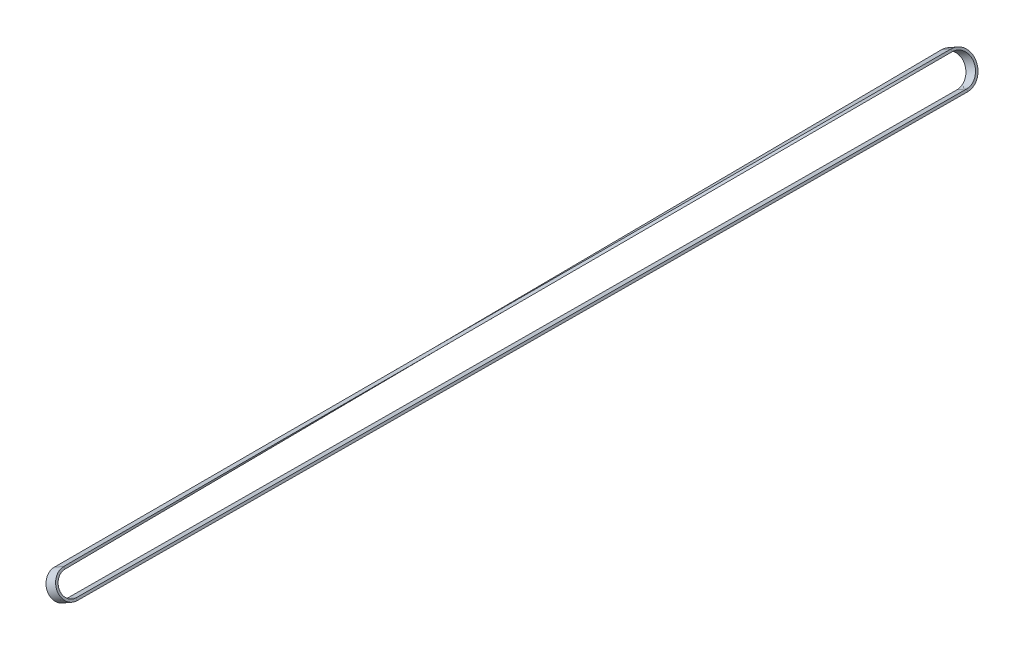
ISO-10303-21;
HEADER;
FILE_DESCRIPTION(('STEP AP214'),'2;1');
FILE_NAME('part.step','',(''),(''),'','','');
FILE_SCHEMA(('AUTOMOTIVE_DESIGN { 1 0 10303 214 1 1 1 1 }'));
ENDSEC;
DATA;
#1=APPLICATION_CONTEXT('core data for automotive mechanical design processes');
#2=APPLICATION_PROTOCOL_DEFINITION('international standard','automotive_design',2000,#1);
#3=PRODUCT_CONTEXT('',#1,'mechanical');
#4=PRODUCT('Part','Part','',(#3));
#5=PRODUCT_RELATED_PRODUCT_CATEGORY('part','',(#4));
#6=PRODUCT_DEFINITION_FORMATION('','',#4);
#7=PRODUCT_DEFINITION_CONTEXT('part definition',#1,'design');
#8=PRODUCT_DEFINITION('design','',#6,#7);
#9=PRODUCT_DEFINITION_SHAPE('','',#8);
#10=(LENGTH_UNIT() NAMED_UNIT(*) SI_UNIT(.MILLI.,.METRE.));
#11=(NAMED_UNIT(*) PLANE_ANGLE_UNIT() SI_UNIT($,.RADIAN.));
#12=(NAMED_UNIT(*) SI_UNIT($,.STERADIAN.) SOLID_ANGLE_UNIT());
#13=UNCERTAINTY_MEASURE_WITH_UNIT(LENGTH_MEASURE(1.E-05),#10,'distance_accuracy_value','');
#14=(GEOMETRIC_REPRESENTATION_CONTEXT(3) GLOBAL_UNCERTAINTY_ASSIGNED_CONTEXT((#13)) GLOBAL_UNIT_ASSIGNED_CONTEXT((#10,
#11,#12)) REPRESENTATION_CONTEXT('',''));
#15=CARTESIAN_POINT('',(0.,0.,0.));
#16=DIRECTION('',(0.,0.,1.));
#17=DIRECTION('',(1.,0.,0.));
#18=AXIS2_PLACEMENT_3D('',#15,#16,#17);
#19=CARTESIAN_POINT('',(-127.156156935267,-0.681139671801417,0.));
#20=DIRECTION('',(-0.865959911098994,-0.500113419505438,0.));
#21=DIRECTION('',(0.500113419505438,-0.865959911098994,0.));
#22=AXIS2_PLACEMENT_3D('',#19,#20,#21);
#23=CONICAL_SURFACE('',#22,4.9994126634338,0.000130970516092662);
#24=CARTESIAN_POINT('',(-127.156156935267,-0.681139671801417,0.));
#25=DIRECTION('',(-0.865959911098994,-0.500113419505438,0.));
#26=DIRECTION('',(0.500113419505438,-0.865959911098994,0.));
#27=AXIS2_PLACEMENT_3D('',#24,#25,#26);
#28=CIRCLE('',#27,4.99941266343379);
#29=CARTESIAN_POINT('',(-124.655883572645,-5.01043061736413,0.));
#30=VERTEX_POINT('',#29);
#31=CARTESIAN_POINT('',(-129.656430297895,3.64815127377289,0.));
#32=VERTEX_POINT('',#31);
#33=EDGE_CURVE('E12',#30,#32,#28,.T.);
#34=ORIENTED_EDGE('',*,*,#33,.T.);
#35=CARTESIAN_POINT('',(-125.326303278973,6.14815127377289,0.));
#36=CARTESIAN_POINT('',(-126.04799111546,5.73148460710636,0.));
#37=CARTESIAN_POINT('',(-126.769678951947,5.31481794043977,0.));
#38=CARTESIAN_POINT('',(-128.213054624921,4.48148460710643,0.));
#39=CARTESIAN_POINT('',(-128.934742461408,4.06481794043969,0.));
#40=CARTESIAN_POINT('',(-129.656430297895,3.64815127377289,0.));
#41=B_SPLINE_CURVE_WITH_KNOTS('',3,(#35,#36,#37,#38,#39,#40),.UNSPECIFIED.,.F.,.F.,(4,2,4),(0.,
0.5,1.),.UNSPECIFIED.);
#42=CARTESIAN_POINT('',(-125.326303278973,6.14815127377289,0.));
#43=VERTEX_POINT('',#42);
#44=EDGE_CURVE('E241',#32,#43,#41,.F.);
#45=ORIENTED_EDGE('',*,*,#44,.T.);
#46=CARTESIAN_POINT('',(-122.826357416907,1.81942740427932,0.));
#47=DIRECTION('',(-0.865959911098994,-0.500113419505438,0.));
#48=DIRECTION('',(0.500113419505438,-0.865959911098994,0.));
#49=AXIS2_PLACEMENT_3D('',#46,#47,#48);
#50=CIRCLE('',#49,4.99875781085521);
#51=CARTESIAN_POINT('',(-120.326411554832,-2.50929646522859,0.));
#52=VERTEX_POINT('',#51);
#53=EDGE_CURVE('E141',#52,#43,#50,.T.);
#54=ORIENTED_EDGE('',*,*,#53,.F.);
#55=DIRECTION('',(-0.865894403559499,-0.500226830432294,0.));
#56=VECTOR('',#55,1.);
#57=CARTESIAN_POINT('',(-124.655883572638,-5.01043061737573,0.));
#58=LINE('',#57,#56);
#59=EDGE_CURVE('E161',#30,#52,#58,.F.);
#60=ORIENTED_EDGE('',*,*,#59,.F.);
#61=EDGE_LOOP('',(#34,#45,#54,#60));
#62=FACE_BOUND('',#61,.T.);
#63=ADVANCED_FACE('F51',(#62),#23,.F.);
#64=CARTESIAN_POINT('',(-127.156043520051,-0.681074171688941,0.));
#65=DIRECTION('',(0.865959911098994,0.500113419505438,0.));
#66=DIRECTION('',(-0.500113419505438,0.865959911098994,0.));
#67=AXIS2_PLACEMENT_3D('',#64,#65,#66);
#68=CONICAL_SURFACE('',#67,5.99941265485715,1.57066535627879);
#69=CARTESIAN_POINT('',(-127.156043520051,-0.681074171688941,0.));
#70=DIRECTION('',(-0.865959911098994,-0.500113419505438,0.));
#71=DIRECTION('',(0.500113419505438,-0.865959911098994,0.));
#72=AXIS2_PLACEMENT_3D('',#69,#70,#71);
#73=CIRCLE('',#72,5.99941265485714);
#74=CARTESIAN_POINT('',(-124.155656742212,-5.87632502092375,0.));
#75=VERTEX_POINT('',#74);
#76=CARTESIAN_POINT('',(-130.156430297895,4.51417667755732,0.));
#77=VERTEX_POINT('',#76);
#78=EDGE_CURVE('E62',#75,#77,#73,.T.);
#79=ORIENTED_EDGE('',*,*,#78,.T.);
#80=CARTESIAN_POINT('',(-129.656430297895,3.64815127377289,0.));
#81=CARTESIAN_POINT('',(-129.739763631229,3.79248884107029,0.));
#82=CARTESIAN_POINT('',(-129.823096964562,3.9368264083677,0.));
#83=CARTESIAN_POINT('',(-129.989763631229,4.22550154296252,0.));
#84=CARTESIAN_POINT('',(-130.073096964562,4.36983911025992,0.));
#85=CARTESIAN_POINT('',(-130.156430297895,4.51417667755732,0.));
#86=B_SPLINE_CURVE_WITH_KNOTS('',3,(#80,#81,#82,#83,#84,#85),.UNSPECIFIED.,.F.,.F.,(4,2,4),(0.,
0.5,1.),.UNSPECIFIED.);
#87=EDGE_CURVE('E101',#77,#32,#86,.F.);
#88=ORIENTED_EDGE('',*,*,#87,.T.);
#89=ORIENTED_EDGE('',*,*,#33,.F.);
#90=DIRECTION('',(0.500226830432308,-0.865894403559491,0.));
#91=VECTOR('',#90,1.);
#92=CARTESIAN_POINT('',(-124.155656742206,-5.87632502093521,0.));
#93=LINE('',#92,#91);
#94=EDGE_CURVE('E150',#75,#30,#93,.F.);
#95=ORIENTED_EDGE('',*,*,#94,.F.);
#96=EDGE_LOOP('',(#79,#88,#89,#95));
#97=FACE_BOUND('',#96,.T.);
#98=ADVANCED_FACE('F53',(#97),#68,.T.);
#99=CARTESIAN_POINT('',(-122.826244001691,1.81949290439178,0.));
#100=DIRECTION('',(-0.865959911098994,-0.500113419505438,0.));
#101=DIRECTION('',(0.500113419505438,-0.865959911098994,0.));
#102=AXIS2_PLACEMENT_3D('',#99,#100,#101);
#103=CONICAL_SURFACE('',#102,5.99875780227857,0.000130970516090581);
#104=CARTESIAN_POINT('',(-122.826244001691,1.81949290439178,0.));
#105=DIRECTION('',(-0.865959911098994,-0.500113419505438,0.));
#106=DIRECTION('',(0.500113419505438,-0.865959911098994,0.));
#107=AXIS2_PLACEMENT_3D('',#104,#105,#106);
#108=CIRCLE('',#107,5.99875780227857);
#109=CARTESIAN_POINT('',(-119.826184724401,-3.37519086878704,0.));
#110=VERTEX_POINT('',#109);
#111=CARTESIAN_POINT('',(-125.826303278973,7.01417667755733,0.));
#112=VERTEX_POINT('',#111);
#113=EDGE_CURVE('E130',#110,#112,#108,.T.);
#114=ORIENTED_EDGE('',*,*,#113,.T.);
#115=CARTESIAN_POINT('',(-130.156430297895,4.51417667755732,0.));
#116=CARTESIAN_POINT('',(-129.434742461409,4.93084334422386,0.));
#117=CARTESIAN_POINT('',(-128.713054624922,5.34751001089047,0.));
#118=CARTESIAN_POINT('',(-127.269678951948,6.18084334422381,0.));
#119=CARTESIAN_POINT('',(-126.54799111546,6.59751001089054,0.));
#120=CARTESIAN_POINT('',(-125.826303278973,7.01417667755733,0.));
#121=B_SPLINE_CURVE_WITH_KNOTS('',3,(#115,#116,#117,#118,#119,#120),.UNSPECIFIED.,.F.,.F.,(4,2,
4),(0.,0.5,1.),.UNSPECIFIED.);
#122=EDGE_CURVE('E123',#112,#77,#121,.F.);
#123=ORIENTED_EDGE('',*,*,#122,.T.);
#124=ORIENTED_EDGE('',*,*,#78,.F.);
#125=DIRECTION('',(-0.8658944035595,-0.500226830432292,0.));
#126=VECTOR('',#125,1.);
#127=CARTESIAN_POINT('',(-119.826184724408,-3.37519086877376,0.));
#128=LINE('',#127,#126);
#129=EDGE_CURVE('E144',#110,#75,#128,.T.);
#130=ORIENTED_EDGE('',*,*,#129,.F.);
#131=EDGE_LOOP('',(#114,#123,#124,#130));
#132=FACE_BOUND('',#131,.T.);
#133=ADVANCED_FACE('F145',(#132),#103,.T.);
#134=CARTESIAN_POINT('',(-122.826357416907,1.81942740427932,0.));
#135=DIRECTION('',(0.865959911098994,0.500113419505438,0.));
#136=DIRECTION('',(-0.500113419505438,0.865959911098994,0.));
#137=AXIS2_PLACEMENT_3D('',#134,#135,#136);
#138=CONICAL_SURFACE('',#137,4.99875781085521,1.57066535627882);
#139=DIRECTION('',(0.500226830432283,-0.865894403559505,0.));
#140=VECTOR('',#139,1.);
#141=CARTESIAN_POINT('',(-120.326411554841,-2.50929646521426,0.));
#142=LINE('',#141,#140);
#143=EDGE_CURVE('E135',#52,#110,#142,.T.);
#144=ORIENTED_EDGE('',*,*,#143,.F.);
#145=ORIENTED_EDGE('',*,*,#53,.T.);
#146=CARTESIAN_POINT('',(-125.826303278973,7.01417667755733,0.));
#147=CARTESIAN_POINT('',(-125.74296994564,6.86983911025995,0.));
#148=CARTESIAN_POINT('',(-125.659636612307,6.72550154296256,0.));
#149=CARTESIAN_POINT('',(-125.49296994564,6.43682640836775,0.));
#150=CARTESIAN_POINT('',(-125.409636612307,6.29248884107033,0.));
#151=CARTESIAN_POINT('',(-125.326303278973,6.14815127377289,0.));
#152=B_SPLINE_CURVE_WITH_KNOTS('',3,(#146,#147,#148,#149,#150,#151),.UNSPECIFIED.,.F.,.F.,(4,2,
4),(0.,0.5,1.),.UNSPECIFIED.);
#153=EDGE_CURVE('E138',#43,#112,#152,.F.);
#154=ORIENTED_EDGE('',*,*,#153,.T.);
#155=ORIENTED_EDGE('',*,*,#113,.F.);
#156=EDGE_LOOP('',(#144,#145,#154,#155));
#157=FACE_BOUND('',#156,.T.);
#158=ADVANCED_FACE('F132',(#157),#138,.F.);
#159=CARTESIAN_POINT('',(-123.406265298371,-7.17784505840634,-400.500012564442));
#160=CARTESIAN_POINT('',(-124.155656742206,-5.87632502093521,3.9795053511379E-13));
#161=CARTESIAN_POINT('',(-122.684522897026,-6.76127291514141,-400.500012564625));
#162=CARTESIAN_POINT('',(-123.434078072573,-5.45946932890831,3.97952059384149E-13));
#163=CARTESIAN_POINT('',(-121.96278049568,-6.34470077187649,-400.500012564808));
#164=CARTESIAN_POINT('',(-122.71249940294,-5.0426136368814,3.97953583654507E-13));
#165=CARTESIAN_POINT('',(-120.519295692989,-5.51155648534663,-400.500012565175));
#166=CARTESIAN_POINT('',(-121.269342063674,-4.20890225282759,3.97956632195225E-13));
#167=CARTESIAN_POINT('',(-119.797553291643,-5.0949843420817,-400.500012565358));
#168=CARTESIAN_POINT('',(-120.547763394041,-3.79204656080067,3.97958156465584E-13));
#169=CARTESIAN_POINT('',(-119.075810890298,-4.67841219881676,-400.500012565541));
#170=CARTESIAN_POINT('',(-119.826184724408,-3.37519086877376,3.97959680735943E-13));
#171=B_SPLINE_SURFACE_WITH_KNOTS('',3,1,((#159,#160),(#161,#162),(#163,#164),(#165,#166),(#167,
#168),(#169,#170)),.UNSPECIFIED.,.F.,.F.,.F.,(4,2,4),(2,2),(0.,0.5,1.),(0.,1.),.UNSPECIFIED.);
#172=DIRECTION('',(0.866090881614713,0.499886571917919,-2.19868567796768E-10));
#173=VECTOR('',#172,1.);
#174=CARTESIAN_POINT('',(-123.406265298371,-7.17784505840634,-400.500012564442));
#175=LINE('',#174,#173);
#176=CARTESIAN_POINT('',(-123.406265298371,-7.17784505840634,-400.500012564442));
#177=VERTEX_POINT('',#176);
#178=CARTESIAN_POINT('',(-119.075810890298,-4.67841219881676,-400.500012565541));
#179=VERTEX_POINT('',#178);
#180=EDGE_CURVE('E165',#177,#179,#175,.T.);
#181=DIRECTION('',(-0.00187357932821233,0.0032539628023521,0.999992950688445));
#182=VECTOR('',#181,1.);
#183=CARTESIAN_POINT('',(-119.450997807353,-4.02680153379526,-200.25000628277));
#184=LINE('',#183,#182);
#185=EDGE_CURVE('E157',#179,#110,#184,.T.);
#186=DIRECTION('',(0.00187112647047279,-0.00324971497072614,-0.999992969094453));
#187=VECTOR('',#186,1.);
#188=CARTESIAN_POINT('',(-123.780961020289,-6.52708503967078,-200.250006282221));
#189=LINE('',#188,#187);
#190=EDGE_CURVE('E168',#75,#177,#189,.T.);
#191=ORIENTED_EDGE('',*,*,#180,.T.);
#192=ORIENTED_EDGE('',*,*,#185,.T.);
#193=ORIENTED_EDGE('',*,*,#129,.T.);
#194=ORIENTED_EDGE('',*,*,#190,.T.);
#195=EDGE_LOOP('',(#191,#192,#193,#194));
#196=FACE_BOUND('',#195,.T.);
#197=ADVANCED_FACE('F163',(#196),#171,.T.);
#198=CARTESIAN_POINT('',(-119.075810890298,-4.67841219881676,-400.500012565541));
#199=CARTESIAN_POINT('',(-119.826184724408,-3.37519086877376,3.97959680735943E-13));
#200=CARTESIAN_POINT('',(-119.159125318951,-4.53406371854787,-400.500012285744));
#201=CARTESIAN_POINT('',(-119.909555862814,-3.23087513484719,3.99123507808963E-13));
#202=CARTESIAN_POINT('',(-119.242439747603,-4.38971523827897,-400.500012005946));
#203=CARTESIAN_POINT('',(-119.992927001219,-3.08655940092061,4.00287334881984E-13));
#204=CARTESIAN_POINT('',(-119.409068604909,-4.10101827774113,-400.500011446351));
#205=CARTESIAN_POINT('',(-120.15966927803,-2.79792793306744,4.02614989028026E-13));
#206=CARTESIAN_POINT('',(-119.492383033562,-3.95666979747221,-400.500011166554));
#207=CARTESIAN_POINT('',(-120.243040416435,-2.65361219914085,4.03778816101047E-13));
#208=CARTESIAN_POINT('',(-119.575697462215,-3.81232131720327,-400.500010886756));
#209=CARTESIAN_POINT('',(-120.326411554841,-2.50929646521426,4.04942643174067E-13));
#210=B_SPLINE_SURFACE_WITH_KNOTS('',3,1,((#198,#199),(#200,#201),(#202,#203),(#204,#205),(#206,
#207),(#208,#209)),.UNSPECIFIED.,.F.,.F.,.F.,(4,2,4),(2,2),(0.,0.5,1.),(0.,1.),.UNSPECIFIED.);
#211=DIRECTION('',(-0.499886571917235,0.866090881613481,1.67878477785875E-06));
#212=VECTOR('',#211,1.);
#213=CARTESIAN_POINT('',(-119.075810890298,-4.67841219881676,-400.500012565541));
#214=LINE('',#213,#212);
#215=CARTESIAN_POINT('',(-119.575697462215,-3.81232131720327,-400.500010886756));
#216=VERTEX_POINT('',#215);
#217=EDGE_CURVE('E167',#179,#216,#214,.T.);
#218=DIRECTION('',(-0.00187442891436856,0.00325347223756892,0.999992950692476));
#219=VECTOR('',#218,1.);
#220=CARTESIAN_POINT('',(-119.951054508528,-3.16080889120877,-200.250005443378));
#221=LINE('',#220,#219);
#222=EDGE_CURVE('E160',#216,#52,#221,.T.);
#223=ORIENTED_EDGE('',*,*,#217,.T.);
#224=ORIENTED_EDGE('',*,*,#222,.T.);
#225=ORIENTED_EDGE('',*,*,#143,.T.);
#226=ORIENTED_EDGE('',*,*,#185,.F.);
#227=EDGE_LOOP('',(#223,#224,#225,#226));
#228=FACE_BOUND('',#227,.T.);
#229=ADVANCED_FACE('F156',(#228),#210,.T.);
#230=CARTESIAN_POINT('',(-123.906151870289,-6.31175417679285,-400.500010885657));
#231=CARTESIAN_POINT('',(-124.655883572638,-5.01043061737573,4.04933497551915E-13));
#232=CARTESIAN_POINT('',(-123.822837441636,-6.45610265706173,-400.500011165454));
#233=CARTESIAN_POINT('',(-124.572512434233,-5.15474635130237,4.03769670478893E-13));
#234=CARTESIAN_POINT('',(-123.739523012983,-6.60045113733062,-400.500011445252));
#235=CARTESIAN_POINT('',(-124.489141295827,-5.29906208522898,4.02605843405872E-13));
#236=CARTESIAN_POINT('',(-123.572894155677,-6.88914809786846,-400.500012004847));
#237=CARTESIAN_POINT('',(-124.322399019016,-5.58769355308214,4.00278189259831E-13));
#238=CARTESIAN_POINT('',(-123.489579727024,-7.03349657813739,-400.500012284644));
#239=CARTESIAN_POINT('',(-124.239027880611,-5.73200928700869,3.9911436218681E-13));
#240=CARTESIAN_POINT('',(-123.406265298371,-7.17784505840634,-400.500012564442));
#241=CARTESIAN_POINT('',(-124.155656742206,-5.87632502093521,3.9795053511379E-13));
#242=B_SPLINE_SURFACE_WITH_KNOTS('',3,1,((#230,#231),(#232,#233),(#234,#235),(#236,#237),(#238,
#239),(#240,#241)),.UNSPECIFIED.,.F.,.F.,.F.,(4,2,4),(2,2),(0.,0.5,1.),(0.,1.),.UNSPECIFIED.);
#243=DIRECTION('',(0.499886571917256,-0.866090881613469,-1.67878477785872E-06));
#244=VECTOR('',#243,1.);
#245=CARTESIAN_POINT('',(-123.906151870289,-6.31175417679285,-400.500010885657));
#246=LINE('',#245,#244);
#247=CARTESIAN_POINT('',(-123.906151870289,-6.31175417679285,-400.500010885657));
#248=VERTEX_POINT('',#247);
#249=EDGE_CURVE('E242',#248,#177,#246,.T.);
#250=DIRECTION('',(-0.00187197605663433,0.00324922440591607,0.999992969098485));
#251=VECTOR('',#250,1.);
#252=CARTESIAN_POINT('',(-124.281017721463,-5.66109239708429,-200.250005442828));
#253=LINE('',#252,#251);
#254=EDGE_CURVE('E282',#248,#30,#253,.T.);
#255=ORIENTED_EDGE('',*,*,#249,.T.);
#256=ORIENTED_EDGE('',*,*,#190,.F.);
#257=ORIENTED_EDGE('',*,*,#94,.T.);
#258=ORIENTED_EDGE('',*,*,#254,.F.);
#259=EDGE_LOOP('',(#255,#256,#257,#258));
#260=FACE_BOUND('',#259,.T.);
#261=ADVANCED_FACE('F196',(#260),#242,.T.);
#262=CARTESIAN_POINT('',(-119.575697462215,-3.81232131720327,-400.500010886756));
#263=CARTESIAN_POINT('',(-120.326411554841,-2.50929646521426,4.04942643174067E-13));
#264=CARTESIAN_POINT('',(-120.29743986356,-4.22889346046811,-400.500010886573));
#265=CARTESIAN_POINT('',(-121.047990224473,-2.9261521572411,4.04941118903709E-13));
#266=CARTESIAN_POINT('',(-121.019182264906,-4.64546560373299,-400.50001088639));
#267=CARTESIAN_POINT('',(-121.769568894106,-3.34300784926797,4.0493959463335E-13));
#268=CARTESIAN_POINT('',(-122.462667067597,-5.47860989026285,-400.500010886023));
#269=CARTESIAN_POINT('',(-123.212726233372,-4.17671923332179,4.04936546092632E-13));
#270=CARTESIAN_POINT('',(-123.184409468943,-5.89518203352782,-400.50001088584));
#271=CARTESIAN_POINT('',(-123.934304903005,-4.59357492534874,4.04935021822273E-13));
#272=CARTESIAN_POINT('',(-123.906151870289,-6.31175417679285,-400.500010885657));
#273=CARTESIAN_POINT('',(-124.655883572638,-5.01043061737573,4.04933497551915E-13));
#274=B_SPLINE_SURFACE_WITH_KNOTS('',3,1,((#262,#263),(#264,#265),(#266,#267),(#268,#269),(#270,
#271),(#272,#273)),.UNSPECIFIED.,.F.,.F.,.F.,(4,2,4),(2,2),(0.,0.5,1.),(0.,1.),.UNSPECIFIED.);
#275=DIRECTION('',(-0.866090881614714,-0.499886571917917,2.19868567796767E-10));
#276=VECTOR('',#275,1.);
#277=CARTESIAN_POINT('',(-119.575697462215,-3.81232131720327,-400.500010886756));
#278=LINE('',#277,#276);
#279=EDGE_CURVE('E170',#216,#248,#278,.T.);
#280=ORIENTED_EDGE('',*,*,#279,.T.);
#281=ORIENTED_EDGE('',*,*,#254,.T.);
#282=ORIENTED_EDGE('',*,*,#59,.T.);
#283=ORIENTED_EDGE('',*,*,#222,.F.);
#284=EDGE_LOOP('',(#280,#281,#282,#283));
#285=FACE_BOUND('',#284,.T.);
#286=ADVANCED_FACE('F211',(#285),#274,.T.);
#287=CARTESIAN_POINT('',(-127.156487546933,-0.682007643190475,-400.499999972429));
#288=DIRECTION('',(0.866025403784439,0.5,0.));
#289=DIRECTION('',(-0.5,0.866025403784439,0.));
#290=AXIS2_PLACEMENT_3D('',#287,#288,#289);
#291=CONICAL_SURFACE('',#290,6.50067135329854,0.000130970516098387);
#292=CARTESIAN_POINT('',(-127.156487546933,-0.682007643190475,-400.499999972429));
#293=DIRECTION('',(0.866025403784439,0.5,0.));
#294=DIRECTION('',(-0.5,0.866025403784439,0.));
#295=AXIS2_PLACEMENT_3D('',#292,#293,#294);
#296=CIRCLE('',#295,6.50067135329855);
#297=CARTESIAN_POINT('',(-130.406823223592,4.94773889043642,-400.499989059201));
#298=VERTEX_POINT('',#297);
#299=EDGE_CURVE('E278',#248,#298,#296,.T.);
#300=ORIENTED_EDGE('',*,*,#299,.F.);
#301=ORIENTED_EDGE('',*,*,#279,.F.);
#302=CARTESIAN_POINT('',(-122.826360565149,1.81799233536792,-400.499999972429));
#303=DIRECTION('',(0.866025403784439,0.5,0.));
#304=DIRECTION('',(-0.5,0.866025403784439,0.));
#305=AXIS2_PLACEMENT_3D('',#302,#303,#304);
#306=CIRCLE('',#305,6.50132620587717);
#307=CARTESIAN_POINT('',(-126.07702366807,7.44830598791617,-400.499989058102));
#308=VERTEX_POINT('',#307);
#309=EDGE_CURVE('E284',#216,#308,#306,.T.);
#310=ORIENTED_EDGE('',*,*,#309,.T.);
#311=DIRECTION('',(0.86595991109899,0.500113419505444,2.19871307571626E-10));
#312=VECTOR('',#311,1.);
#313=CARTESIAN_POINT('',(-130.406823223578,4.9477388904119,-400.499989059201));
#314=LINE('',#313,#312);
#315=EDGE_CURVE('E56',#298,#308,#314,.T.);
#316=ORIENTED_EDGE('',*,*,#315,.F.);
#317=EDGE_LOOP('',(#300,#301,#310,#316));
#318=FACE_BOUND('',#317,.T.);
#319=ADVANCED_FACE('F260',(#318),#291,.F.);
#320=CARTESIAN_POINT('',(-127.156600970727,-0.682073128448318,-400.499999972429));
#321=DIRECTION('',(-0.866025403784439,-0.5,0.));
#322=DIRECTION('',(0.5,-0.866025403784439,0.));
#323=AXIS2_PLACEMENT_3D('',#320,#321,#322);
#324=CONICAL_SURFACE('',#323,7.50067134472192,1.57066535627885);
#325=CARTESIAN_POINT('',(-127.156600970727,-0.682073128448318,-400.499999972429));
#326=DIRECTION('',(0.866025403784439,0.5,0.));
#327=DIRECTION('',(-0.5,0.866025403784439,0.));
#328=AXIS2_PLACEMENT_3D('',#325,#326,#327);
#329=CIRCLE('',#328,7.50067134472193);
#330=CARTESIAN_POINT('',(-130.906936643097,5.81369880153407,-400.499987380416));
#331=VERTEX_POINT('',#330);
#332=EDGE_CURVE('E272',#177,#331,#329,.T.);
#333=ORIENTED_EDGE('',*,*,#332,.F.);
#334=ORIENTED_EDGE('',*,*,#249,.F.);
#335=ORIENTED_EDGE('',*,*,#299,.T.);
#336=DIRECTION('',(-0.500113419504698,0.865959911097794,1.67878476136167E-06));
#337=VECTOR('',#336,1.);
#338=CARTESIAN_POINT('',(-130.906936643083,5.8136988015097,-400.499987380416));
#339=LINE('',#338,#337);
#340=EDGE_CURVE('E288',#331,#298,#339,.F.);
#341=ORIENTED_EDGE('',*,*,#340,.F.);
#342=EDGE_LOOP('',(#333,#334,#335,#341));
#343=FACE_BOUND('',#342,.T.);
#344=ADVANCED_FACE('F250',(#343),#324,.F.);
#345=CARTESIAN_POINT('',(-122.826473988943,1.81792685011007,-400.499999972429));
#346=DIRECTION('',(0.866025403784439,0.5,0.));
#347=DIRECTION('',(-0.5,0.866025403784439,0.));
#348=AXIS2_PLACEMENT_3D('',#345,#346,#347);
#349=CONICAL_SURFACE('',#348,7.50132619730053,0.000130970516097694);
#350=CARTESIAN_POINT('',(-122.826473988943,1.81792685011007,-400.499999972429));
#351=DIRECTION('',(0.866025403784439,0.5,0.));
#352=DIRECTION('',(-0.5,0.866025403784439,0.));
#353=AXIS2_PLACEMENT_3D('',#350,#351,#352);
#354=CIRCLE('',#353,7.50132619730053);
#355=CARTESIAN_POINT('',(-126.577137087575,8.31426589901413,-400.499987379317));
#356=VERTEX_POINT('',#355);
#357=EDGE_CURVE('E279',#179,#356,#354,.T.);
#358=ORIENTED_EDGE('',*,*,#357,.F.);
#359=ORIENTED_EDGE('',*,*,#180,.F.);
#360=ORIENTED_EDGE('',*,*,#332,.T.);
#361=DIRECTION('',(0.865959911098991,0.500113419505444,2.19871308137608E-10));
#362=VECTOR('',#361,1.);
#363=CARTESIAN_POINT('',(-126.577137087588,8.3142658990369,-400.499987379317));
#364=LINE('',#363,#362);
#365=EDGE_CURVE('E604',#356,#331,#364,.F.);
#366=ORIENTED_EDGE('',*,*,#365,.F.);
#367=EDGE_LOOP('',(#358,#359,#360,#366));
#368=FACE_BOUND('',#367,.T.);
#369=ADVANCED_FACE('F259',(#368),#349,.T.);
#370=CARTESIAN_POINT('',(-122.826360565149,1.81799233536792,-400.499999972429));
#371=DIRECTION('',(-0.866025403784439,-0.5,0.));
#372=DIRECTION('',(0.5,-0.866025403784439,0.));
#373=AXIS2_PLACEMENT_3D('',#370,#371,#372);
#374=CONICAL_SURFACE('',#373,6.50132620587716,1.5706653562788);
#375=ORIENTED_EDGE('',*,*,#217,.F.);
#376=ORIENTED_EDGE('',*,*,#357,.T.);
#377=DIRECTION('',(-0.500113419504734,0.865959911097773,1.67878476136167E-06));
#378=VECTOR('',#377,1.);
#379=CARTESIAN_POINT('',(-126.077023668083,7.44830598793911,-400.499989058102));
#380=LINE('',#379,#378);
#381=EDGE_CURVE('E590',#308,#356,#380,.T.);
#382=ORIENTED_EDGE('',*,*,#381,.F.);
#383=ORIENTED_EDGE('',*,*,#309,.F.);
#384=EDGE_LOOP('',(#375,#376,#382,#383));
#385=FACE_BOUND('',#384,.T.);
#386=ADVANCED_FACE('F264',(#385),#374,.T.);
#387=CARTESIAN_POINT('',(-130.906936643083,5.81369880150968,-400.499987380416));
#388=CARTESIAN_POINT('',(-129.656430297895,3.64815127377289,0.));
#389=CARTESIAN_POINT('',(-130.823584406498,5.66937214966007,-400.499987660214));
#390=CARTESIAN_POINT('',(-128.934742461408,4.06481794043969,0.));
#391=CARTESIAN_POINT('',(-130.740232169914,5.52504549781044,-400.499987940011));
#392=CARTESIAN_POINT('',(-128.213054624921,4.48148460710643,0.));
#393=CARTESIAN_POINT('',(-130.573527696746,5.23639219411118,-400.499988499606));
#394=CARTESIAN_POINT('',(-126.769678951947,5.31481794043977,0.));
#395=CARTESIAN_POINT('',(-130.490175460162,5.09206554226154,-400.499988779404));
#396=CARTESIAN_POINT('',(-126.04799111546,5.73148460710636,0.));
#397=CARTESIAN_POINT('',(-130.406823223578,4.94773889041189,-400.499989059201));
#398=CARTESIAN_POINT('',(-125.326303278973,6.14815127377289,0.));
#399=B_SPLINE_SURFACE_WITH_KNOTS('',3,1,((#387,#388),(#389,#390),(#391,#392),(#393,#394),(#395,
#396),(#397,#398)),.UNSPECIFIED.,.F.,.F.,.F.,(4,2,4),(2,2),(0.,0.5,1.),(0.,1.),.UNSPECIFIED.);
#400=DIRECTION('',(0.0126843658865501,0.00299702984169296,0.999915058729582));
#401=VECTOR('',#400,1.);
#402=CARTESIAN_POINT('',(-127.866563251276,5.54794508209239,-200.249994529601));
#403=LINE('',#402,#401);
#404=EDGE_CURVE('E585',#298,#43,#403,.T.);
#405=DIRECTION('',(-0.00312230214528816,0.00540700470461327,-0.999980507574742));
#406=VECTOR('',#405,1.);
#407=CARTESIAN_POINT('',(-130.281683470489,4.73092503764129,-200.249993690208));
#408=LINE('',#407,#406);
#409=EDGE_CURVE('E588',#32,#331,#408,.T.);
#410=ORIENTED_EDGE('',*,*,#340,.T.);
#411=ORIENTED_EDGE('',*,*,#404,.T.);
#412=ORIENTED_EDGE('',*,*,#44,.F.);
#413=ORIENTED_EDGE('',*,*,#409,.T.);
#414=EDGE_LOOP('',(#410,#411,#412,#413));
#415=FACE_BOUND('',#414,.T.);
#416=ADVANCED_FACE('F371',(#415),#399,.T.);
#417=CARTESIAN_POINT('',(-130.406823223578,4.94773889041189,-400.499989059201));
#418=CARTESIAN_POINT('',(-125.326303278973,6.14815127377289,0.));
#419=CARTESIAN_POINT('',(-129.685189964329,5.36450007333304,-400.499989059018));
#420=CARTESIAN_POINT('',(-125.409636612307,6.29248884107033,0.));
#421=CARTESIAN_POINT('',(-128.96355670508,5.78126125625422,-400.499989058835));
#422=CARTESIAN_POINT('',(-125.49296994564,6.43682640836775,0.));
#423=CARTESIAN_POINT('',(-127.520290186581,6.61478362209662,-400.499989058468));
#424=CARTESIAN_POINT('',(-125.659636612307,6.72550154296256,0.));
#425=CARTESIAN_POINT('',(-126.798656927332,7.03154480501785,-400.499989058285));
#426=CARTESIAN_POINT('',(-125.74296994564,6.86983911025995,0.));
#427=CARTESIAN_POINT('',(-126.077023668083,7.4483059879391,-400.499989058102));
#428=CARTESIAN_POINT('',(-125.826303278973,7.01417667755733,0.));
#429=B_SPLINE_SURFACE_WITH_KNOTS('',3,1,((#417,#418),(#419,#420),(#421,#422),(#423,#424),(#425,
#426),(#427,#428)),.UNSPECIFIED.,.F.,.F.,.F.,(4,2,4),(2,2),(0.,0.5,1.),(0.,1.),.UNSPECIFIED.);
#430=DIRECTION('',(0.000626017976366078,-0.00108396749594795,0.999999216557674));
#431=VECTOR('',#430,1.);
#432=CARTESIAN_POINT('',(-125.951663473528,7.23124133274821,-200.249994529051));
#433=LINE('',#432,#431);
#434=EDGE_CURVE('E586',#308,#112,#433,.T.);
#435=ORIENTED_EDGE('',*,*,#315,.T.);
#436=ORIENTED_EDGE('',*,*,#434,.T.);
#437=ORIENTED_EDGE('',*,*,#153,.F.);
#438=ORIENTED_EDGE('',*,*,#404,.F.);
#439=EDGE_LOOP('',(#435,#436,#437,#438));
#440=FACE_BOUND('',#439,.T.);
#441=ADVANCED_FACE('F381',(#440),#429,.T.);
#442=CARTESIAN_POINT('',(-126.577137087588,8.31426589903688,-400.499987379317));
#443=CARTESIAN_POINT('',(-130.156430297895,4.51417667755732,0.));
#444=CARTESIAN_POINT('',(-127.298770346837,7.89750471611569,-400.4999873795));
#445=CARTESIAN_POINT('',(-130.073096964562,4.36983911025992,0.));
#446=CARTESIAN_POINT('',(-128.020403606086,7.48074353319449,-400.499987379683));
#447=CARTESIAN_POINT('',(-129.989763631229,4.22550154296252,0.));
#448=CARTESIAN_POINT('',(-129.463670124584,6.64722116735209,-400.49998738005));
#449=CARTESIAN_POINT('',(-129.823096964562,3.9368264083677,0.));
#450=CARTESIAN_POINT('',(-130.185303383833,6.23045998443089,-400.499987380233));
#451=CARTESIAN_POINT('',(-129.739763631229,3.79248884107029,0.));
#452=CARTESIAN_POINT('',(-130.906936643083,5.81369880150968,-400.499987380416));
#453=CARTESIAN_POINT('',(-129.656430297895,3.64815127377289,0.));
#454=B_SPLINE_SURFACE_WITH_KNOTS('',3,1,((#442,#443),(#444,#445),(#446,#447),(#448,#449),(#450,
#451),(#452,#453)),.UNSPECIFIED.,.F.,.F.,.F.,(4,2,4),(2,2),(0.,0.5,1.),(0.,1.),.UNSPECIFIED.);
#455=DIRECTION('',(-0.0089363028731064,-0.00948755696520582,0.999915060769559));
#456=VECTOR('',#455,1.);
#457=CARTESIAN_POINT('',(-128.366783692742,6.4142212882971,-200.249993689658));
#458=LINE('',#457,#456);
#459=EDGE_CURVE('E597',#356,#77,#458,.T.);
#460=ORIENTED_EDGE('',*,*,#365,.T.);
#461=ORIENTED_EDGE('',*,*,#409,.F.);
#462=ORIENTED_EDGE('',*,*,#87,.F.);
#463=ORIENTED_EDGE('',*,*,#459,.F.);
#464=EDGE_LOOP('',(#460,#461,#462,#463));
#465=FACE_BOUND('',#464,.T.);
#466=ADVANCED_FACE('F333',(#465),#454,.T.);
#467=CARTESIAN_POINT('',(-126.077023668083,7.4483059879391,-400.499989058102));
#468=CARTESIAN_POINT('',(-125.826303278973,7.01417667755733,0.));
#469=CARTESIAN_POINT('',(-126.160375904667,7.59263263978871,-400.499988778304));
#470=CARTESIAN_POINT('',(-126.54799111546,6.59751001089054,0.));
#471=CARTESIAN_POINT('',(-126.243728141251,7.73695929163834,-400.499988498507));
#472=CARTESIAN_POINT('',(-127.269678951948,6.18084334422381,0.));
#473=CARTESIAN_POINT('',(-126.410432614419,8.0256125953376,-400.499987938912));
#474=CARTESIAN_POINT('',(-128.713054624922,5.34751001089047,0.));
#475=CARTESIAN_POINT('',(-126.493784851004,8.16993924718724,-400.499987659114));
#476=CARTESIAN_POINT('',(-129.434742461409,4.93084334422386,0.));
#477=CARTESIAN_POINT('',(-126.577137087588,8.31426589903688,-400.499987379317));
#478=CARTESIAN_POINT('',(-130.156430297895,4.51417667755732,0.));
#479=B_SPLINE_SURFACE_WITH_KNOTS('',3,1,((#467,#468),(#469,#470),(#471,#472),(#473,#474),(#475,
#476),(#477,#478)),.UNSPECIFIED.,.F.,.F.,.F.,(4,2,4),(2,2),(0.,0.5,1.),(0.,1.),.UNSPECIFIED.);
#480=ORIENTED_EDGE('',*,*,#381,.T.);
#481=ORIENTED_EDGE('',*,*,#459,.T.);
#482=ORIENTED_EDGE('',*,*,#122,.F.);
#483=ORIENTED_EDGE('',*,*,#434,.F.);
#484=EDGE_LOOP('',(#480,#481,#482,#483));
#485=FACE_BOUND('',#484,.T.);
#486=ADVANCED_FACE('F327',(#485),#479,.T.);
#487=CLOSED_SHELL('',(#63,#98,#133,#158,#197,#229,#261,#286,#319,#344,#369,#386,#416,#441,#466,#486));
#488=MANIFOLD_SOLID_BREP('B2',#487);
#489=ADVANCED_BREP_SHAPE_REPRESENTATION('',(#18,#488),#14);
#490=SHAPE_DEFINITION_REPRESENTATION(#9,#489);
ENDSEC;
END-ISO-10303-21;
